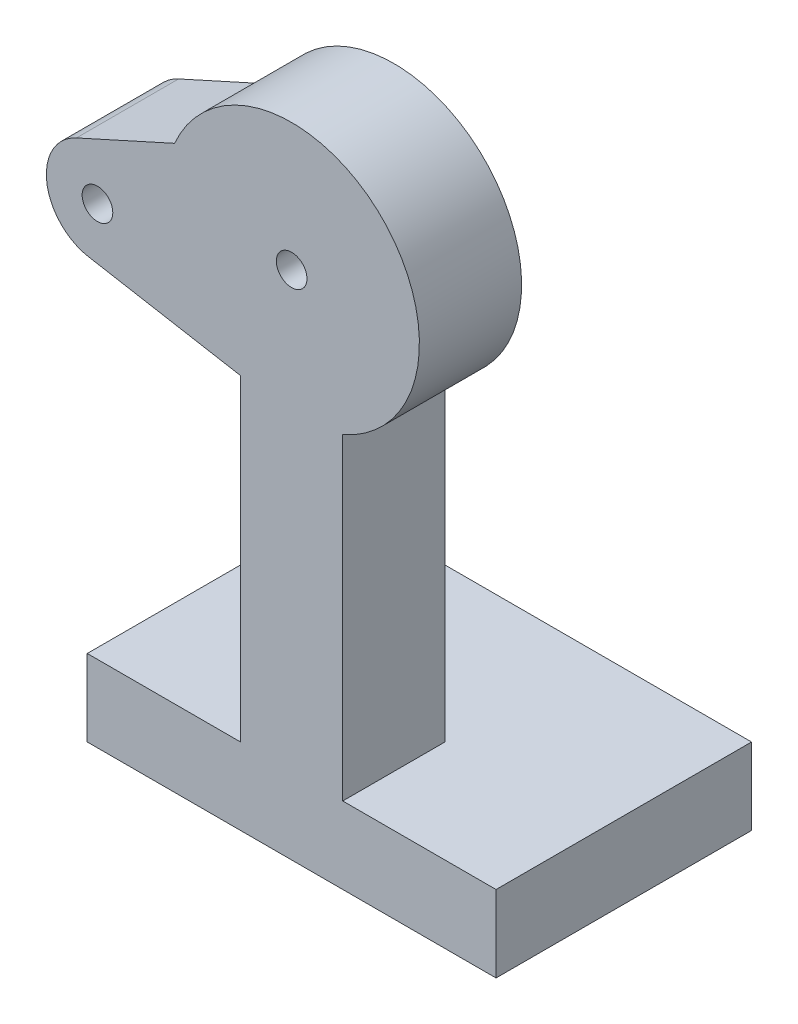
ISO-10303-21;
HEADER;
FILE_DESCRIPTION(('STEP AP214'),'2;1');
FILE_NAME('part.step','',(''),(''),'','','');
FILE_SCHEMA(('AUTOMOTIVE_DESIGN { 1 0 10303 214 1 1 1 1 }'));
ENDSEC;
DATA;
#1=APPLICATION_CONTEXT('core data for automotive mechanical design processes');
#2=APPLICATION_PROTOCOL_DEFINITION('international standard','automotive_design',2000,#1);
#3=PRODUCT_CONTEXT('',#1,'mechanical');
#4=PRODUCT('Part','Part','',(#3));
#5=PRODUCT_RELATED_PRODUCT_CATEGORY('part','',(#4));
#6=PRODUCT_DEFINITION_FORMATION('','',#4);
#7=PRODUCT_DEFINITION_CONTEXT('part definition',#1,'design');
#8=PRODUCT_DEFINITION('design','',#6,#7);
#9=PRODUCT_DEFINITION_SHAPE('','',#8);
#10=(LENGTH_UNIT() NAMED_UNIT(*) SI_UNIT(.MILLI.,.METRE.));
#11=(NAMED_UNIT(*) PLANE_ANGLE_UNIT() SI_UNIT($,.RADIAN.));
#12=(NAMED_UNIT(*) SI_UNIT($,.STERADIAN.) SOLID_ANGLE_UNIT());
#13=UNCERTAINTY_MEASURE_WITH_UNIT(LENGTH_MEASURE(1.E-05),#10,'distance_accuracy_value','');
#14=(GEOMETRIC_REPRESENTATION_CONTEXT(3) GLOBAL_UNCERTAINTY_ASSIGNED_CONTEXT((#13)) GLOBAL_UNIT_ASSIGNED_CONTEXT((#10,
#11,#12)) REPRESENTATION_CONTEXT('',''));
#15=CARTESIAN_POINT('',(0.,0.,0.));
#16=DIRECTION('',(0.,0.,1.));
#17=DIRECTION('',(1.,0.,0.));
#18=AXIS2_PLACEMENT_3D('',#15,#16,#17);
#19=CARTESIAN_POINT('',(0.,92.5,-10.));
#20=DIRECTION('',(0.,0.,1.));
#21=DIRECTION('',(1.,0.,0.));
#22=AXIS2_PLACEMENT_3D('',#19,#20,#21);
#23=PLANE('',#22);
#24=CARTESIAN_POINT('',(0.,92.5,-10.));
#25=DIRECTION('',(0.,0.,1.));
#26=DIRECTION('',(1.,0.,0.));
#27=AXIS2_PLACEMENT_3D('',#24,#25,#26);
#28=CIRCLE('',#27,3.);
#29=CARTESIAN_POINT('',(3.00000000000001,92.5,-10.));
#30=VERTEX_POINT('',#29);
#31=EDGE_CURVE('E270',#30,#30,#28,.T.);
#32=ORIENTED_EDGE('',*,*,#31,.T.);
#33=EDGE_LOOP('',(#32));
#34=FACE_BOUND('',#33,.T.);
#35=DIRECTION('',(1.,0.,0.));
#36=VECTOR('',#35,1.);
#37=CARTESIAN_POINT('',(0.,7.49999999999999,-10.));
#38=LINE('',#37,#36);
#39=CARTESIAN_POINT('',(-10.,7.5,-10.));
#40=VERTEX_POINT('',#39);
#41=CARTESIAN_POINT('',(10.,7.5,-10.));
#42=VERTEX_POINT('',#41);
#43=EDGE_CURVE('E11',#40,#42,#38,.T.);
#44=ORIENTED_EDGE('',*,*,#43,.F.);
#45=DIRECTION('',(0.,1.,0.));
#46=VECTOR('',#45,1.);
#47=CARTESIAN_POINT('',(-10.,7.5,-10.));
#48=LINE('',#47,#46);
#49=CARTESIAN_POINT('',(-10.,69.5871215252208,-10.));
#50=VERTEX_POINT('',#49);
#51=EDGE_CURVE('E155',#40,#50,#48,.T.);
#52=ORIENTED_EDGE('',*,*,#51,.T.);
#53=DIRECTION('',(0.984686020321396,-0.174337148604686,0.));
#54=VECTOR('',#53,1.);
#55=CARTESIAN_POINT('',(11.6419025450266,65.7554558955524,-10.));
#56=LINE('',#55,#54);
#57=CARTESIAN_POINT('',(-39.7433714860469,74.853139796786,-10.));
#58=VERTEX_POINT('',#57);
#59=EDGE_CURVE('E255',#58,#50,#56,.T.);
#60=ORIENTED_EDGE('',*,*,#59,.F.);
#61=CARTESIAN_POINT('',(-38.,84.7,-10.));
#62=DIRECTION('',(0.,0.,1.));
#63=DIRECTION('',(1.,0.,0.));
#64=AXIS2_PLACEMENT_3D('',#61,#62,#63);
#65=CIRCLE('',#64,10.);
#66=CARTESIAN_POINT('',(-42.1213737111313,93.8112171927353,-10.));
#67=VERTEX_POINT('',#66);
#68=EDGE_CURVE('E247',#58,#67,#65,.F.);
#69=ORIENTED_EDGE('',*,*,#68,.T.);
#70=DIRECTION('',(0.911121719273531,0.412137371113133,0.));
#71=VECTOR('',#70,1.);
#72=CARTESIAN_POINT('',(-42.3814169618385,93.6935890652799,-10.));
#73=LINE('',#72,#71);
#74=CARTESIAN_POINT('',(-22.9128784747792,102.5,-10.));
#75=VERTEX_POINT('',#74);
#76=EDGE_CURVE('E252',#67,#75,#73,.T.);
#77=ORIENTED_EDGE('',*,*,#76,.T.);
#78=CARTESIAN_POINT('',(0.,92.5,-10.));
#79=DIRECTION('',(0.,0.,1.));
#80=DIRECTION('',(1.,0.,0.));
#81=AXIS2_PLACEMENT_3D('',#78,#79,#80);
#82=CIRCLE('',#81,25.);
#83=CARTESIAN_POINT('',(10.,69.5871215252208,-10.));
#84=VERTEX_POINT('',#83);
#85=EDGE_CURVE('E150',#84,#75,#82,.T.);
#86=ORIENTED_EDGE('',*,*,#85,.F.);
#87=DIRECTION('',(0.,1.,0.));
#88=VECTOR('',#87,1.);
#89=CARTESIAN_POINT('',(10.,7.5,-10.));
#90=LINE('',#89,#88);
#91=EDGE_CURVE('E147',#42,#84,#90,.T.);
#92=ORIENTED_EDGE('',*,*,#91,.F.);
#93=EDGE_LOOP('',(#44,#52,#60,#69,#77,#86,#92));
#94=FACE_BOUND('',#93,.T.);
#95=CARTESIAN_POINT('',(-38.,84.7,-10.));
#96=DIRECTION('',(0.,0.,1.));
#97=DIRECTION('',(1.,0.,0.));
#98=AXIS2_PLACEMENT_3D('',#95,#96,#97);
#99=CIRCLE('',#98,3.00000000000001);
#100=CARTESIAN_POINT('',(-35.,84.7,-10.));
#101=VERTEX_POINT('',#100);
#102=EDGE_CURVE('E230',#101,#101,#99,.F.);
#103=ORIENTED_EDGE('',*,*,#102,.F.);
#104=EDGE_LOOP('',(#103));
#105=FACE_BOUND('',#104,.T.);
#106=ADVANCED_FACE('F47',(#34,#94,#105),#23,.F.);
#107=CARTESIAN_POINT('',(10.,7.5,10.));
#108=DIRECTION('',(-1.,0.,0.));
#109=DIRECTION('',(0.,-1.,0.));
#110=AXIS2_PLACEMENT_3D('',#107,#108,#109);
#111=PLANE('',#110);
#112=ORIENTED_EDGE('',*,*,#91,.T.);
#113=DIRECTION('',(0.,0.,-1.));
#114=VECTOR('',#113,1.);
#115=CARTESIAN_POINT('',(10.,69.5871215252208,10.));
#116=LINE('',#115,#114);
#117=CARTESIAN_POINT('',(10.,69.5871215252208,10.));
#118=VERTEX_POINT('',#117);
#119=EDGE_CURVE('E57',#118,#84,#116,.T.);
#120=ORIENTED_EDGE('',*,*,#119,.F.);
#121=DIRECTION('',(0.,1.,0.));
#122=VECTOR('',#121,1.);
#123=CARTESIAN_POINT('',(10.,7.5,10.));
#124=LINE('',#123,#122);
#125=CARTESIAN_POINT('',(10.,7.5,10.));
#126=VERTEX_POINT('',#125);
#127=EDGE_CURVE('E159',#126,#118,#124,.T.);
#128=ORIENTED_EDGE('',*,*,#127,.F.);
#129=DIRECTION('',(0.,0.,-1.));
#130=VECTOR('',#129,1.);
#131=CARTESIAN_POINT('',(10.,7.5,10.));
#132=LINE('',#131,#130);
#133=EDGE_CURVE('E64',#126,#42,#132,.T.);
#134=ORIENTED_EDGE('',*,*,#133,.T.);
#135=EDGE_LOOP('',(#112,#120,#128,#134));
#136=FACE_BOUND('',#135,.T.);
#137=ADVANCED_FACE('F49',(#136),#111,.F.);
#138=CARTESIAN_POINT('',(0.,92.5,10.));
#139=DIRECTION('',(0.,0.,-1.));
#140=DIRECTION('',(-1.,0.,0.));
#141=AXIS2_PLACEMENT_3D('',#138,#139,#140);
#142=CYLINDRICAL_SURFACE('',#141,25.);
#143=ORIENTED_EDGE('',*,*,#85,.T.);
#144=DIRECTION('',(0.,0.,1.));
#145=VECTOR('',#144,1.);
#146=CARTESIAN_POINT('',(-22.9128784747792,102.5,-60.2718367428085));
#147=LINE('',#146,#145);
#148=CARTESIAN_POINT('',(-22.9128784747792,102.5,10.));
#149=VERTEX_POINT('',#148);
#150=EDGE_CURVE('E253',#75,#149,#147,.T.);
#151=ORIENTED_EDGE('',*,*,#150,.T.);
#152=CARTESIAN_POINT('',(0.,92.5,10.));
#153=DIRECTION('',(0.,0.,1.));
#154=DIRECTION('',(1.,0.,0.));
#155=AXIS2_PLACEMENT_3D('',#152,#153,#154);
#156=CIRCLE('',#155,25.);
#157=EDGE_CURVE('E91',#118,#149,#156,.T.);
#158=ORIENTED_EDGE('',*,*,#157,.F.);
#159=ORIENTED_EDGE('',*,*,#119,.T.);
#160=EDGE_LOOP('',(#143,#151,#158,#159));
#161=FACE_BOUND('',#160,.T.);
#162=ADVANCED_FACE('F177',(#161),#142,.T.);
#163=CARTESIAN_POINT('',(-10.,7.5,10.));
#164=DIRECTION('',(-1.,0.,0.));
#165=DIRECTION('',(0.,-1.,0.));
#166=AXIS2_PLACEMENT_3D('',#163,#164,#165);
#167=PLANE('',#166);
#168=ORIENTED_EDGE('',*,*,#51,.F.);
#169=DIRECTION('',(0.,0.,-1.));
#170=VECTOR('',#169,1.);
#171=CARTESIAN_POINT('',(-10.,7.5,10.));
#172=LINE('',#171,#170);
#173=CARTESIAN_POINT('',(-10.,7.5,10.));
#174=VERTEX_POINT('',#173);
#175=EDGE_CURVE('E78',#174,#40,#172,.T.);
#176=ORIENTED_EDGE('',*,*,#175,.F.);
#177=DIRECTION('',(0.,1.,0.));
#178=VECTOR('',#177,1.);
#179=CARTESIAN_POINT('',(-10.,7.5,10.));
#180=LINE('',#179,#178);
#181=CARTESIAN_POINT('',(-9.99999999999998,69.5871215252208,10.));
#182=VERTEX_POINT('',#181);
#183=EDGE_CURVE('E289',#174,#182,#180,.T.);
#184=ORIENTED_EDGE('',*,*,#183,.T.);
#185=DIRECTION('',(0.,0.,-1.));
#186=VECTOR('',#185,1.);
#187=CARTESIAN_POINT('',(-9.99999999999998,69.5871215252208,10.));
#188=LINE('',#187,#186);
#189=EDGE_CURVE('E172',#182,#50,#188,.T.);
#190=ORIENTED_EDGE('',*,*,#189,.T.);
#191=EDGE_LOOP('',(#168,#176,#184,#190));
#192=FACE_BOUND('',#191,.T.);
#193=ADVANCED_FACE('F327',(#192),#167,.T.);
#194=CARTESIAN_POINT('',(-40.,7.5,10.));
#195=DIRECTION('',(1.,0.,0.));
#196=DIRECTION('',(0.,0.,-1.));
#197=AXIS2_PLACEMENT_3D('',#194,#195,#196);
#198=PLANE('',#197);
#199=DIRECTION('',(0.,1.,0.));
#200=VECTOR('',#199,1.);
#201=CARTESIAN_POINT('',(-40.,-7.5,-40.));
#202=LINE('',#201,#200);
#203=CARTESIAN_POINT('',(-40.,-7.5,-40.));
#204=VERTEX_POINT('',#203);
#205=CARTESIAN_POINT('',(-40.,7.5,-40.));
#206=VERTEX_POINT('',#205);
#207=EDGE_CURVE('E151',#204,#206,#202,.T.);
#208=ORIENTED_EDGE('',*,*,#207,.F.);
#209=DIRECTION('',(0.,0.,-1.));
#210=VECTOR('',#209,1.);
#211=CARTESIAN_POINT('',(-40.,-7.5,10.));
#212=LINE('',#211,#210);
#213=CARTESIAN_POINT('',(-40.,-7.5,10.));
#214=VERTEX_POINT('',#213);
#215=EDGE_CURVE('E135',#214,#204,#212,.T.);
#216=ORIENTED_EDGE('',*,*,#215,.F.);
#217=DIRECTION('',(0.,-1.,0.));
#218=VECTOR('',#217,1.);
#219=CARTESIAN_POINT('',(-40.,7.5,10.));
#220=LINE('',#219,#218);
#221=CARTESIAN_POINT('',(-40.,7.5,10.));
#222=VERTEX_POINT('',#221);
#223=EDGE_CURVE('E118',#222,#214,#220,.T.);
#224=ORIENTED_EDGE('',*,*,#223,.F.);
#225=DIRECTION('',(0.,0.,-1.));
#226=VECTOR('',#225,1.);
#227=CARTESIAN_POINT('',(-40.,7.5,10.));
#228=LINE('',#227,#226);
#229=EDGE_CURVE('E166',#222,#206,#228,.T.);
#230=ORIENTED_EDGE('',*,*,#229,.T.);
#231=EDGE_LOOP('',(#208,#216,#224,#230));
#232=FACE_BOUND('',#231,.T.);
#233=ADVANCED_FACE('F322',(#232),#198,.F.);
#234=CARTESIAN_POINT('',(-40.,-7.5,10.));
#235=DIRECTION('',(0.,1.,0.));
#236=DIRECTION('',(-1.,0.,0.));
#237=AXIS2_PLACEMENT_3D('',#234,#235,#236);
#238=PLANE('',#237);
#239=DIRECTION('',(-1.,0.,0.));
#240=VECTOR('',#239,1.);
#241=CARTESIAN_POINT('',(40.,-7.5,-40.));
#242=LINE('',#241,#240);
#243=CARTESIAN_POINT('',(40.,-7.5,-40.));
#244=VERTEX_POINT('',#243);
#245=EDGE_CURVE('E130',#244,#204,#242,.T.);
#246=ORIENTED_EDGE('',*,*,#245,.F.);
#247=DIRECTION('',(0.,0.,-1.));
#248=VECTOR('',#247,1.);
#249=CARTESIAN_POINT('',(40.,-7.5,10.));
#250=LINE('',#249,#248);
#251=CARTESIAN_POINT('',(40.,-7.5,10.));
#252=VERTEX_POINT('',#251);
#253=EDGE_CURVE('E126',#252,#244,#250,.T.);
#254=ORIENTED_EDGE('',*,*,#253,.F.);
#255=DIRECTION('',(1.,0.,0.));
#256=VECTOR('',#255,1.);
#257=CARTESIAN_POINT('',(-40.,-7.5,10.));
#258=LINE('',#257,#256);
#259=EDGE_CURVE('E109',#214,#252,#258,.T.);
#260=ORIENTED_EDGE('',*,*,#259,.F.);
#261=ORIENTED_EDGE('',*,*,#215,.T.);
#262=EDGE_LOOP('',(#246,#254,#260,#261));
#263=FACE_BOUND('',#262,.T.);
#264=ADVANCED_FACE('F127',(#263),#238,.F.);
#265=CARTESIAN_POINT('',(40.,7.5,10.));
#266=DIRECTION('',(1.,0.,0.));
#267=DIRECTION('',(0.,0.,-1.));
#268=AXIS2_PLACEMENT_3D('',#265,#266,#267);
#269=PLANE('',#268);
#270=DIRECTION('',(0.,-1.,0.));
#271=VECTOR('',#270,1.);
#272=CARTESIAN_POINT('',(40.,7.5,-40.));
#273=LINE('',#272,#271);
#274=CARTESIAN_POINT('',(40.,7.5,-40.));
#275=VERTEX_POINT('',#274);
#276=EDGE_CURVE('E277',#275,#244,#273,.T.);
#277=ORIENTED_EDGE('',*,*,#276,.F.);
#278=DIRECTION('',(0.,0.,-1.));
#279=VECTOR('',#278,1.);
#280=CARTESIAN_POINT('',(40.,7.5,10.));
#281=LINE('',#280,#279);
#282=CARTESIAN_POINT('',(40.,7.5,10.));
#283=VERTEX_POINT('',#282);
#284=EDGE_CURVE('E136',#283,#275,#281,.T.);
#285=ORIENTED_EDGE('',*,*,#284,.F.);
#286=DIRECTION('',(0.,-1.,0.));
#287=VECTOR('',#286,1.);
#288=CARTESIAN_POINT('',(40.,7.5,10.));
#289=LINE('',#288,#287);
#290=EDGE_CURVE('E115',#283,#252,#289,.T.);
#291=ORIENTED_EDGE('',*,*,#290,.T.);
#292=ORIENTED_EDGE('',*,*,#253,.T.);
#293=EDGE_LOOP('',(#277,#285,#291,#292));
#294=FACE_BOUND('',#293,.T.);
#295=ADVANCED_FACE('F138',(#294),#269,.T.);
#296=CARTESIAN_POINT('',(10.,7.5,10.));
#297=DIRECTION('',(0.,1.,0.));
#298=DIRECTION('',(-1.,0.,0.));
#299=AXIS2_PLACEMENT_3D('',#296,#297,#298);
#300=PLANE('',#299);
#301=ORIENTED_EDGE('',*,*,#43,.T.);
#302=ORIENTED_EDGE('',*,*,#133,.F.);
#303=DIRECTION('',(1.,0.,0.));
#304=VECTOR('',#303,1.);
#305=CARTESIAN_POINT('',(10.,7.5,10.));
#306=LINE('',#305,#304);
#307=EDGE_CURVE('E141',#126,#283,#306,.T.);
#308=ORIENTED_EDGE('',*,*,#307,.T.);
#309=ORIENTED_EDGE('',*,*,#284,.T.);
#310=DIRECTION('',(1.,0.,0.));
#311=VECTOR('',#310,1.);
#312=CARTESIAN_POINT('',(10.,7.5,-40.));
#313=LINE('',#312,#311);
#314=EDGE_CURVE('E273',#206,#275,#313,.T.);
#315=ORIENTED_EDGE('',*,*,#314,.F.);
#316=ORIENTED_EDGE('',*,*,#229,.F.);
#317=DIRECTION('',(1.,0.,0.));
#318=VECTOR('',#317,1.);
#319=CARTESIAN_POINT('',(-40.,7.5,10.));
#320=LINE('',#319,#318);
#321=EDGE_CURVE('E293',#222,#174,#320,.T.);
#322=ORIENTED_EDGE('',*,*,#321,.T.);
#323=ORIENTED_EDGE('',*,*,#175,.T.);
#324=EDGE_LOOP('',(#301,#302,#308,#309,#315,#316,#322,#323));
#325=FACE_BOUND('',#324,.T.);
#326=ADVANCED_FACE('F183',(#325),#300,.T.);
#327=CARTESIAN_POINT('',(0.,92.5,10.));
#328=DIRECTION('',(0.,0.,1.));
#329=DIRECTION('',(1.,0.,0.));
#330=AXIS2_PLACEMENT_3D('',#327,#328,#329);
#331=PLANE('',#330);
#332=CARTESIAN_POINT('',(0.,92.5,10.));
#333=DIRECTION('',(0.,0.,1.));
#334=DIRECTION('',(1.,0.,0.));
#335=AXIS2_PLACEMENT_3D('',#332,#333,#334);
#336=CIRCLE('',#335,3.);
#337=CARTESIAN_POINT('',(3.00000000000001,92.5,10.));
#338=VERTEX_POINT('',#337);
#339=EDGE_CURVE('E251',#338,#338,#336,.T.);
#340=ORIENTED_EDGE('',*,*,#339,.F.);
#341=EDGE_LOOP('',(#340));
#342=FACE_BOUND('',#341,.T.);
#343=ORIENTED_EDGE('',*,*,#127,.T.);
#344=ORIENTED_EDGE('',*,*,#157,.T.);
#345=DIRECTION('',(-0.911121719273531,-0.412137371113133,0.));
#346=VECTOR('',#345,1.);
#347=CARTESIAN_POINT('',(-42.3814169618385,93.6935890652799,10.));
#348=LINE('',#347,#346);
#349=CARTESIAN_POINT('',(-42.1213737111313,93.8112171927353,10.));
#350=VERTEX_POINT('',#349);
#351=EDGE_CURVE('E240',#149,#350,#348,.T.);
#352=ORIENTED_EDGE('',*,*,#351,.T.);
#353=CARTESIAN_POINT('',(-38.,84.7,10.));
#354=DIRECTION('',(0.,0.,1.));
#355=DIRECTION('',(1.,0.,0.));
#356=AXIS2_PLACEMENT_3D('',#353,#354,#355);
#357=CIRCLE('',#356,10.);
#358=CARTESIAN_POINT('',(-39.7433714860469,74.853139796786,10.));
#359=VERTEX_POINT('',#358);
#360=EDGE_CURVE('E263',#350,#359,#357,.T.);
#361=ORIENTED_EDGE('',*,*,#360,.T.);
#362=DIRECTION('',(-0.984686020321395,0.174337148604686,0.));
#363=VECTOR('',#362,1.);
#364=CARTESIAN_POINT('',(11.6419025450266,65.7554558955524,10.));
#365=LINE('',#364,#363);
#366=EDGE_CURVE('E242',#182,#359,#365,.T.);
#367=ORIENTED_EDGE('',*,*,#366,.F.);
#368=ORIENTED_EDGE('',*,*,#183,.F.);
#369=ORIENTED_EDGE('',*,*,#321,.F.);
#370=ORIENTED_EDGE('',*,*,#223,.T.);
#371=ORIENTED_EDGE('',*,*,#259,.T.);
#372=ORIENTED_EDGE('',*,*,#290,.F.);
#373=ORIENTED_EDGE('',*,*,#307,.F.);
#374=EDGE_LOOP('',(#343,#344,#352,#361,#367,#368,#369,#370,#371,#372,#373));
#375=FACE_BOUND('',#374,.T.);
#376=CARTESIAN_POINT('',(-38.,84.7,10.));
#377=DIRECTION('',(0.,0.,1.));
#378=DIRECTION('',(1.,0.,0.));
#379=AXIS2_PLACEMENT_3D('',#376,#377,#378);
#380=CIRCLE('',#379,3.00000000000001);
#381=CARTESIAN_POINT('',(-35.,84.7,10.));
#382=VERTEX_POINT('',#381);
#383=EDGE_CURVE('E233',#382,#382,#380,.T.);
#384=ORIENTED_EDGE('',*,*,#383,.F.);
#385=EDGE_LOOP('',(#384));
#386=FACE_BOUND('',#385,.T.);
#387=ADVANCED_FACE('F111',(#342,#375,#386),#331,.T.);
#388=CARTESIAN_POINT('',(0.,0.,-40.));
#389=DIRECTION('',(0.,0.,-1.));
#390=DIRECTION('',(-1.,0.,0.));
#391=AXIS2_PLACEMENT_3D('',#388,#389,#390);
#392=PLANE('',#391);
#393=ORIENTED_EDGE('',*,*,#314,.T.);
#394=ORIENTED_EDGE('',*,*,#276,.T.);
#395=ORIENTED_EDGE('',*,*,#245,.T.);
#396=ORIENTED_EDGE('',*,*,#207,.T.);
#397=EDGE_LOOP('',(#393,#394,#395,#396));
#398=FACE_BOUND('',#397,.T.);
#399=ADVANCED_FACE('F191',(#398),#392,.T.);
#400=CARTESIAN_POINT('',(0.,92.5,-40.));
#401=DIRECTION('',(0.,0.,1.));
#402=DIRECTION('',(1.,0.,0.));
#403=AXIS2_PLACEMENT_3D('',#400,#401,#402);
#404=CYLINDRICAL_SURFACE('',#403,3.);
#405=ORIENTED_EDGE('',*,*,#339,.T.);
#406=EDGE_LOOP('',(#405));
#407=FACE_BOUND('',#406,.T.);
#408=ORIENTED_EDGE('',*,*,#31,.F.);
#409=EDGE_LOOP('',(#408));
#410=FACE_BOUND('',#409,.T.);
#411=ADVANCED_FACE('F206',(#407,#410),#404,.F.);
#412=CARTESIAN_POINT('',(-42.3814169618385,93.6935890652799,-60.2718367428085));
#413=DIRECTION('',(-0.412137371113133,0.911121719273531,0.));
#414=DIRECTION('',(-0.911121719273531,-0.412137371113133,0.));
#415=AXIS2_PLACEMENT_3D('',#412,#413,#414);
#416=PLANE('',#415);
#417=ORIENTED_EDGE('',*,*,#76,.F.);
#418=DIRECTION('',(0.,0.,1.));
#419=VECTOR('',#418,1.);
#420=CARTESIAN_POINT('',(-42.1213737111313,93.8112171927353,-60.2718367428085));
#421=LINE('',#420,#419);
#422=EDGE_CURVE('E256',#67,#350,#421,.T.);
#423=ORIENTED_EDGE('',*,*,#422,.T.);
#424=ORIENTED_EDGE('',*,*,#351,.F.);
#425=ORIENTED_EDGE('',*,*,#150,.F.);
#426=EDGE_LOOP('',(#417,#423,#424,#425));
#427=FACE_BOUND('',#426,.T.);
#428=ADVANCED_FACE('F209',(#427),#416,.T.);
#429=CARTESIAN_POINT('',(11.6419025450266,65.7554558955524,-60.2718367428085));
#430=DIRECTION('',(0.174337148604686,0.984686020321396,0.));
#431=DIRECTION('',(-0.984686020321396,0.174337148604686,0.));
#432=AXIS2_PLACEMENT_3D('',#429,#430,#431);
#433=PLANE('',#432);
#434=DIRECTION('',(0.,0.,1.));
#435=VECTOR('',#434,1.);
#436=CARTESIAN_POINT('',(-39.7433714860469,74.853139796786,-60.2718367428085));
#437=LINE('',#436,#435);
#438=EDGE_CURVE('E235',#58,#359,#437,.T.);
#439=ORIENTED_EDGE('',*,*,#438,.F.);
#440=ORIENTED_EDGE('',*,*,#59,.T.);
#441=ORIENTED_EDGE('',*,*,#189,.F.);
#442=ORIENTED_EDGE('',*,*,#366,.T.);
#443=EDGE_LOOP('',(#439,#440,#441,#442));
#444=FACE_BOUND('',#443,.T.);
#445=ADVANCED_FACE('F213',(#444),#433,.F.);
#446=CARTESIAN_POINT('',(-38.,84.7,-60.2718367428085));
#447=DIRECTION('',(0.,0.,1.));
#448=DIRECTION('',(1.,0.,0.));
#449=AXIS2_PLACEMENT_3D('',#446,#447,#448);
#450=CYLINDRICAL_SURFACE('',#449,3.00000000000001);
#451=ORIENTED_EDGE('',*,*,#102,.T.);
#452=EDGE_LOOP('',(#451));
#453=FACE_BOUND('',#452,.T.);
#454=ORIENTED_EDGE('',*,*,#383,.T.);
#455=EDGE_LOOP('',(#454));
#456=FACE_BOUND('',#455,.T.);
#457=ADVANCED_FACE('F217',(#453,#456),#450,.F.);
#458=CARTESIAN_POINT('',(-38.,84.7,-60.2718367428085));
#459=DIRECTION('',(0.,0.,1.));
#460=DIRECTION('',(1.,0.,0.));
#461=AXIS2_PLACEMENT_3D('',#458,#459,#460);
#462=CYLINDRICAL_SURFACE('',#461,10.);
#463=ORIENTED_EDGE('',*,*,#68,.F.);
#464=ORIENTED_EDGE('',*,*,#438,.T.);
#465=ORIENTED_EDGE('',*,*,#360,.F.);
#466=ORIENTED_EDGE('',*,*,#422,.F.);
#467=EDGE_LOOP('',(#463,#464,#465,#466));
#468=FACE_BOUND('',#467,.T.);
#469=ADVANCED_FACE('F219',(#468),#462,.T.);
#470=CLOSED_SHELL('',(#106,#137,#162,#193,#233,#264,#295,#326,#387,#399,#411,#428,#445,#457,#469));
#471=MANIFOLD_SOLID_BREP('B2',#470);
#472=ADVANCED_BREP_SHAPE_REPRESENTATION('',(#18,#471),#14);
#473=SHAPE_DEFINITION_REPRESENTATION(#9,#472);
ENDSEC;
END-ISO-10303-21;
